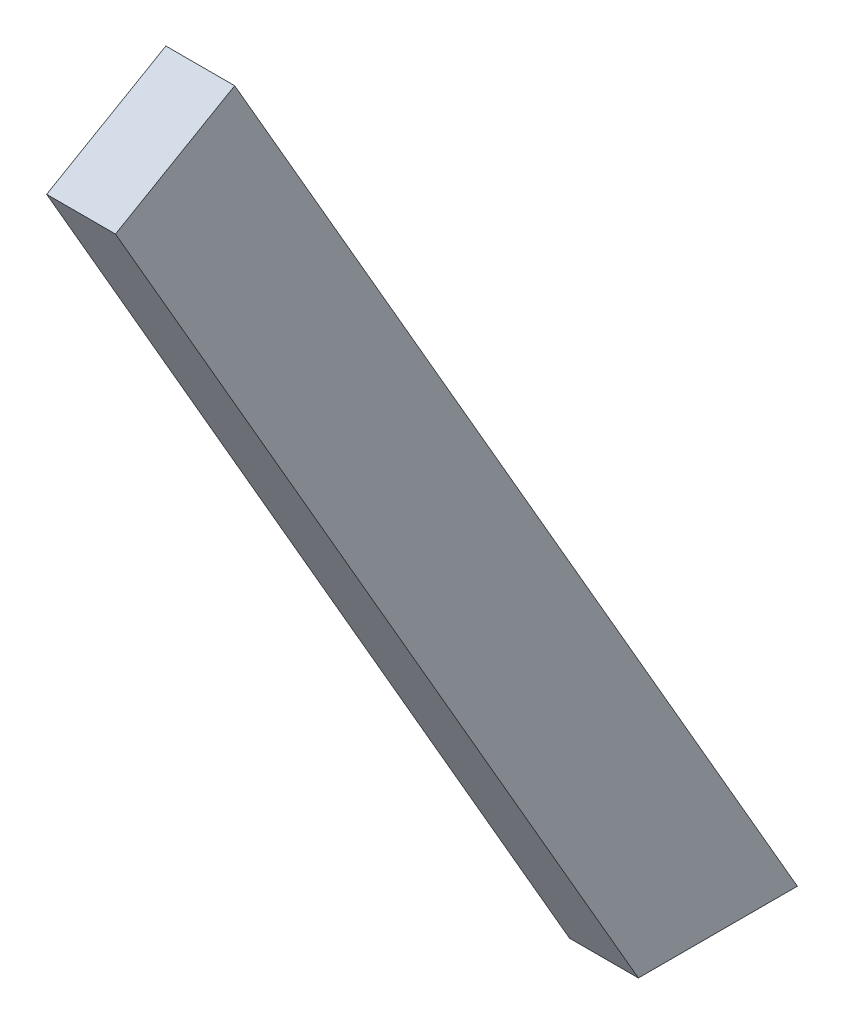
ISO-10303-21;
HEADER;
FILE_DESCRIPTION(('STEP AP214'),'2;1');
FILE_NAME('part.step','',(''),(''),'','','');
FILE_SCHEMA(('AUTOMOTIVE_DESIGN { 1 0 10303 214 1 1 1 1 }'));
ENDSEC;
DATA;
#1=APPLICATION_CONTEXT('core data for automotive mechanical design processes');
#2=APPLICATION_PROTOCOL_DEFINITION('international standard','automotive_design',2000,#1);
#3=PRODUCT_CONTEXT('',#1,'mechanical');
#4=PRODUCT('Part','Part','',(#3));
#5=PRODUCT_RELATED_PRODUCT_CATEGORY('part','',(#4));
#6=PRODUCT_DEFINITION_FORMATION('','',#4);
#7=PRODUCT_DEFINITION_CONTEXT('part definition',#1,'design');
#8=PRODUCT_DEFINITION('design','',#6,#7);
#9=PRODUCT_DEFINITION_SHAPE('','',#8);
#10=(LENGTH_UNIT() NAMED_UNIT(*) SI_UNIT(.MILLI.,.METRE.));
#11=(NAMED_UNIT(*) PLANE_ANGLE_UNIT() SI_UNIT($,.RADIAN.));
#12=(NAMED_UNIT(*) SI_UNIT($,.STERADIAN.) SOLID_ANGLE_UNIT());
#13=UNCERTAINTY_MEASURE_WITH_UNIT(LENGTH_MEASURE(1.E-05),#10,'distance_accuracy_value','');
#14=(GEOMETRIC_REPRESENTATION_CONTEXT(3) GLOBAL_UNCERTAINTY_ASSIGNED_CONTEXT((#13)) GLOBAL_UNIT_ASSIGNED_CONTEXT((#10,
#11,#12)) REPRESENTATION_CONTEXT('',''));
#15=CARTESIAN_POINT('',(0.,0.,0.));
#16=DIRECTION('',(0.,0.,1.));
#17=DIRECTION('',(1.,0.,0.));
#18=AXIS2_PLACEMENT_3D('',#15,#16,#17);
#19=CARTESIAN_POINT('',(25.4,0.,-58.6587873496659));
#20=DIRECTION('',(0.,1.,0.));
#21=DIRECTION('',(0.,0.,1.));
#22=AXIS2_PLACEMENT_3D('',#19,#20,#21);
#23=PLANE('',#22);
#24=DIRECTION('',(0.,0.,-1.));
#25=VECTOR('',#24,1.);
#26=CARTESIAN_POINT('',(0.,0.,-58.6587873496659));
#27=LINE('',#26,#25);
#28=CARTESIAN_POINT('',(0.,0.,0.));
#29=VERTEX_POINT('',#28);
#30=CARTESIAN_POINT('',(0.,0.,-58.6587873496659));
#31=VERTEX_POINT('',#30);
#32=EDGE_CURVE('E96',#29,#31,#27,.T.);
#33=ORIENTED_EDGE('',*,*,#32,.T.);
#34=DIRECTION('',(-1.,0.,0.));
#35=VECTOR('',#34,1.);
#36=CARTESIAN_POINT('',(25.4,0.,-58.6587873496659));
#37=LINE('',#36,#35);
#38=CARTESIAN_POINT('',(25.4,0.,-58.6587873496659));
#39=VERTEX_POINT('',#38);
#40=EDGE_CURVE('E11',#39,#31,#37,.T.);
#41=ORIENTED_EDGE('',*,*,#40,.F.);
#42=DIRECTION('',(0.,0.,-1.));
#43=VECTOR('',#42,1.);
#44=CARTESIAN_POINT('',(25.4,0.,-58.6587873496659));
#45=LINE('',#44,#43);
#46=CARTESIAN_POINT('',(25.4,0.,0.));
#47=VERTEX_POINT('',#46);
#48=EDGE_CURVE('E84',#47,#39,#45,.T.);
#49=ORIENTED_EDGE('',*,*,#48,.F.);
#50=DIRECTION('',(-1.,0.,0.));
#51=VECTOR('',#50,1.);
#52=CARTESIAN_POINT('',(25.4,0.,0.));
#53=LINE('',#52,#51);
#54=EDGE_CURVE('E92',#47,#29,#53,.T.);
#55=ORIENTED_EDGE('',*,*,#54,.T.);
#56=EDGE_LOOP('',(#33,#41,#49,#55));
#57=FACE_BOUND('',#56,.T.);
#58=ADVANCED_FACE('F33',(#57),#23,.F.);
#59=CARTESIAN_POINT('',(25.4,359.659791631547,148.990890165491));
#60=DIRECTION('',(0.,-0.499999999999998,0.86602540378444));
#61=DIRECTION('',(0.,-0.86602540378444,-0.499999999999998));
#62=AXIS2_PLACEMENT_3D('',#59,#60,#61);
#63=PLANE('',#62);
#64=DIRECTION('',(0.,0.86602540378444,0.499999999999998));
#65=VECTOR('',#64,1.);
#66=CARTESIAN_POINT('',(0.,359.659791631547,148.990890165491));
#67=LINE('',#66,#65);
#68=CARTESIAN_POINT('',(0.,359.659791631547,148.990890165491));
#69=VERTEX_POINT('',#68);
#70=EDGE_CURVE('E88',#31,#69,#67,.T.);
#71=ORIENTED_EDGE('',*,*,#70,.T.);
#72=DIRECTION('',(-1.,0.,0.));
#73=VECTOR('',#72,1.);
#74=CARTESIAN_POINT('',(25.4,359.659791631547,148.990890165491));
#75=LINE('',#74,#73);
#76=CARTESIAN_POINT('',(25.4,359.659791631547,148.990890165491));
#77=VERTEX_POINT('',#76);
#78=EDGE_CURVE('E41',#77,#69,#75,.T.);
#79=ORIENTED_EDGE('',*,*,#78,.F.);
#80=DIRECTION('',(0.,0.86602540378444,0.499999999999998));
#81=VECTOR('',#80,1.);
#82=CARTESIAN_POINT('',(25.4,359.659791631547,148.990890165491));
#83=LINE('',#82,#81);
#84=EDGE_CURVE('E79',#39,#77,#83,.T.);
#85=ORIENTED_EDGE('',*,*,#84,.F.);
#86=ORIENTED_EDGE('',*,*,#40,.T.);
#87=EDGE_LOOP('',(#71,#79,#85,#86));
#88=FACE_BOUND('',#87,.T.);
#89=ADVANCED_FACE('F87',(#88),#63,.F.);
#90=CARTESIAN_POINT('',(25.4,334.259791631547,192.984980677741));
#91=DIRECTION('',(0.,-0.866025403784439,-0.499999999999998));
#92=DIRECTION('',(0.,0.499999999999998,-0.86602540378444));
#93=AXIS2_PLACEMENT_3D('',#90,#91,#92);
#94=PLANE('',#93);
#95=DIRECTION('',(0.,-0.499999999999998,0.86602540378444));
#96=VECTOR('',#95,1.);
#97=CARTESIAN_POINT('',(0.,334.259791631547,192.984980677741));
#98=LINE('',#97,#96);
#99=CARTESIAN_POINT('',(0.,334.259791631547,192.984980677741));
#100=VERTEX_POINT('',#99);
#101=EDGE_CURVE('E66',#69,#100,#98,.T.);
#102=ORIENTED_EDGE('',*,*,#101,.T.);
#103=DIRECTION('',(-1.,0.,0.));
#104=VECTOR('',#103,1.);
#105=CARTESIAN_POINT('',(25.4,334.259791631547,192.984980677741));
#106=LINE('',#105,#104);
#107=CARTESIAN_POINT('',(25.4,334.259791631547,192.984980677741));
#108=VERTEX_POINT('',#107);
#109=EDGE_CURVE('E89',#108,#100,#106,.T.);
#110=ORIENTED_EDGE('',*,*,#109,.F.);
#111=DIRECTION('',(0.,-0.499999999999998,0.86602540378444));
#112=VECTOR('',#111,1.);
#113=CARTESIAN_POINT('',(25.4,334.259791631547,192.984980677741));
#114=LINE('',#113,#112);
#115=EDGE_CURVE('E82',#77,#108,#114,.T.);
#116=ORIENTED_EDGE('',*,*,#115,.F.);
#117=ORIENTED_EDGE('',*,*,#78,.T.);
#118=EDGE_LOOP('',(#102,#110,#116,#117));
#119=FACE_BOUND('',#118,.T.);
#120=ADVANCED_FACE('F90',(#119),#94,.F.);
#121=CARTESIAN_POINT('',(25.4,0.,0.));
#122=DIRECTION('',(0.,0.499999999999998,-0.86602540378444));
#123=DIRECTION('',(0.,0.86602540378444,0.499999999999998));
#124=AXIS2_PLACEMENT_3D('',#121,#122,#123);
#125=PLANE('',#124);
#126=DIRECTION('',(0.,-0.86602540378444,-0.499999999999998));
#127=VECTOR('',#126,1.);
#128=CARTESIAN_POINT('',(0.,0.,0.));
#129=LINE('',#128,#127);
#130=EDGE_CURVE('E72',#100,#29,#129,.T.);
#131=ORIENTED_EDGE('',*,*,#130,.T.);
#132=ORIENTED_EDGE('',*,*,#54,.F.);
#133=DIRECTION('',(0.,-0.86602540378444,-0.499999999999998));
#134=VECTOR('',#133,1.);
#135=CARTESIAN_POINT('',(25.4,0.,0.));
#136=LINE('',#135,#134);
#137=EDGE_CURVE('E49',#108,#47,#136,.T.);
#138=ORIENTED_EDGE('',*,*,#137,.F.);
#139=ORIENTED_EDGE('',*,*,#109,.T.);
#140=EDGE_LOOP('',(#131,#132,#138,#139));
#141=FACE_BOUND('',#140,.T.);
#142=ADVANCED_FACE('F103',(#141),#125,.F.);
#143=CARTESIAN_POINT('',(25.4,0.,0.));
#144=DIRECTION('',(-1.,0.,0.));
#145=DIRECTION('',(0.,0.,1.));
#146=AXIS2_PLACEMENT_3D('',#143,#144,#145);
#147=PLANE('',#146);
#148=ORIENTED_EDGE('',*,*,#48,.T.);
#149=ORIENTED_EDGE('',*,*,#84,.T.);
#150=ORIENTED_EDGE('',*,*,#115,.T.);
#151=ORIENTED_EDGE('',*,*,#137,.T.);
#152=EDGE_LOOP('',(#148,#149,#150,#151));
#153=FACE_BOUND('',#152,.T.);
#154=ADVANCED_FACE('F80',(#153),#147,.F.);
#155=CARTESIAN_POINT('',(0.,0.,0.));
#156=DIRECTION('',(-1.,0.,0.));
#157=DIRECTION('',(0.,0.,1.));
#158=AXIS2_PLACEMENT_3D('',#155,#156,#157);
#159=PLANE('',#158);
#160=ORIENTED_EDGE('',*,*,#32,.F.);
#161=ORIENTED_EDGE('',*,*,#130,.F.);
#162=ORIENTED_EDGE('',*,*,#101,.F.);
#163=ORIENTED_EDGE('',*,*,#70,.F.);
#164=EDGE_LOOP('',(#160,#161,#162,#163));
#165=FACE_BOUND('',#164,.T.);
#166=ADVANCED_FACE('F106',(#165),#159,.T.);
#167=CLOSED_SHELL('',(#58,#89,#120,#142,#154,#166));
#168=MANIFOLD_SOLID_BREP('B2',#167);
#169=ADVANCED_BREP_SHAPE_REPRESENTATION('',(#18,#168),#14);
#170=SHAPE_DEFINITION_REPRESENTATION(#9,#169);
ENDSEC;
END-ISO-10303-21;
